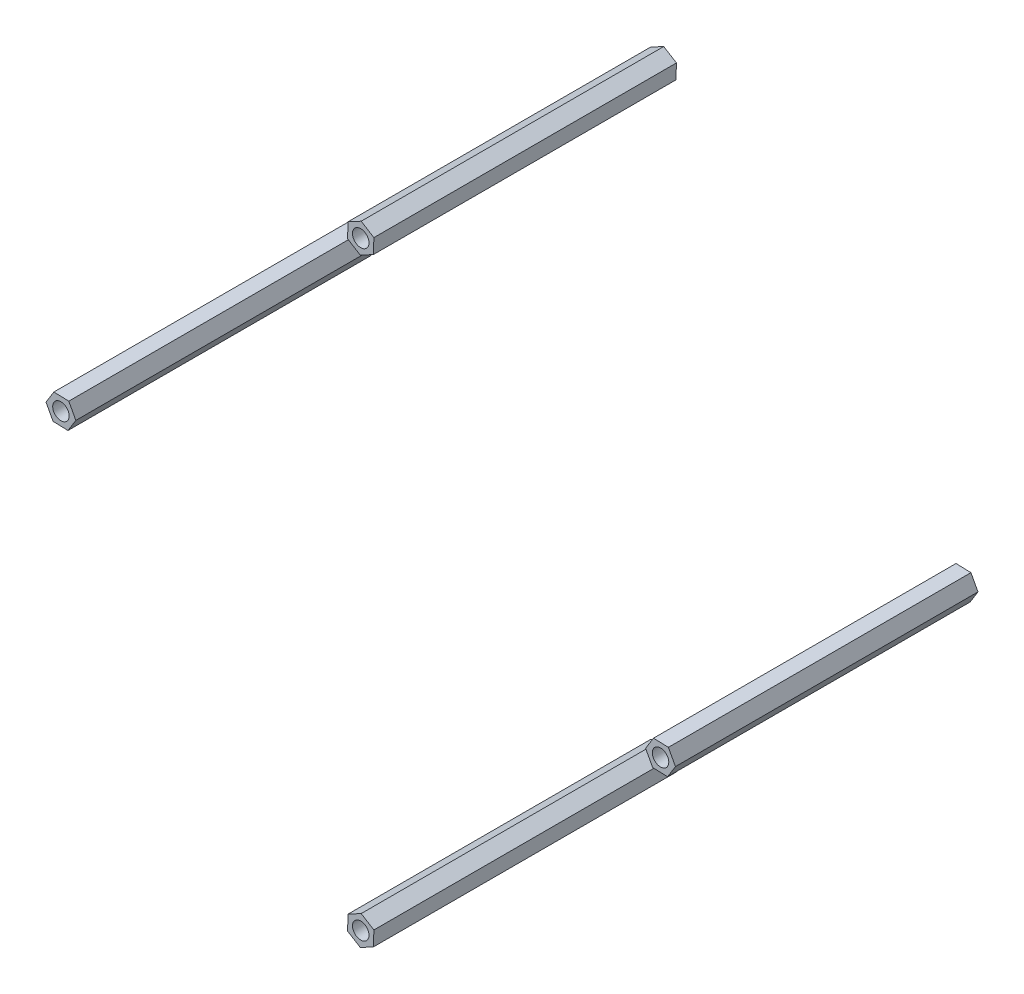
ISO-10303-21;
HEADER;
FILE_DESCRIPTION(('STEP AP214'),'2;1');
FILE_NAME('part.step','',(''),(''),'','','');
FILE_SCHEMA(('AUTOMOTIVE_DESIGN { 1 0 10303 214 1 1 1 1 }'));
ENDSEC;
DATA;
#1=APPLICATION_CONTEXT('core data for automotive mechanical design processes');
#2=APPLICATION_PROTOCOL_DEFINITION('international standard','automotive_design',2000,#1);
#3=PRODUCT_CONTEXT('',#1,'mechanical');
#4=PRODUCT('Part','Part','',(#3));
#5=PRODUCT_RELATED_PRODUCT_CATEGORY('part','',(#4));
#6=PRODUCT_DEFINITION_FORMATION('','',#4);
#7=PRODUCT_DEFINITION_CONTEXT('part definition',#1,'design');
#8=PRODUCT_DEFINITION('design','',#6,#7);
#9=PRODUCT_DEFINITION_SHAPE('','',#8);
#10=(LENGTH_UNIT() NAMED_UNIT(*) SI_UNIT(.MILLI.,.METRE.));
#11=(NAMED_UNIT(*) PLANE_ANGLE_UNIT() SI_UNIT($,.RADIAN.));
#12=(NAMED_UNIT(*) SI_UNIT($,.STERADIAN.) SOLID_ANGLE_UNIT());
#13=UNCERTAINTY_MEASURE_WITH_UNIT(LENGTH_MEASURE(1.E-05),#10,'distance_accuracy_value','');
#14=(GEOMETRIC_REPRESENTATION_CONTEXT(3) GLOBAL_UNCERTAINTY_ASSIGNED_CONTEXT((#13)) GLOBAL_UNIT_ASSIGNED_CONTEXT((#10,
#11,#12)) REPRESENTATION_CONTEXT('',''));
#15=CARTESIAN_POINT('',(0.,0.,0.));
#16=DIRECTION('',(0.,0.,1.));
#17=DIRECTION('',(1.,0.,0.));
#18=AXIS2_PLACEMENT_3D('',#15,#16,#17);
#19=CARTESIAN_POINT('',(0.,0.,55.));
#20=DIRECTION('',(0.,0.,1.));
#21=DIRECTION('',(1.,0.,0.));
#22=AXIS2_PLACEMENT_3D('',#19,#20,#21);
#23=PLANE('',#22);
#24=DIRECTION('',(-0.472942625739873,0.881093225917822,0.));
#25=VECTOR('',#24,1.);
#26=CARTESIAN_POINT('',(-51.7877550712293,-54.5840284457493,55.));
#27=LINE('',#26,#25);
#28=CARTESIAN_POINT('',(-51.7877550712293,-54.5840284457493,55.));
#29=VERTEX_POINT('',#28);
#30=CARTESIAN_POINT('',(-53.0711067669555,-52.1931412132747,55.));
#31=VERTEX_POINT('',#30);
#32=EDGE_CURVE('E140',#29,#31,#27,.T.);
#33=ORIENTED_EDGE('',*,*,#32,.T.);
#34=DIRECTION('',(-0.999520429617152,0.0309662845356627,0.));
#35=VECTOR('',#34,1.);
#36=CARTESIAN_POINT('',(-53.0711067669555,-52.1931412132747,55.));
#37=LINE('',#36,#35);
#38=CARTESIAN_POINT('',(-55.7833516957255,-52.1091127675261,55.));
#39=VERTEX_POINT('',#38);
#40=EDGE_CURVE('E98',#31,#39,#37,.T.);
#41=ORIENTED_EDGE('',*,*,#40,.T.);
#42=DIRECTION('',(-0.526577803877276,-0.850126941382159,0.));
#43=VECTOR('',#42,1.);
#44=CARTESIAN_POINT('',(-55.7833516957255,-52.1091127675261,55.));
#45=LINE('',#44,#43);
#46=CARTESIAN_POINT('',(-57.2122449287692,-54.4159715542521,55.));
#47=VERTEX_POINT('',#46);
#48=EDGE_CURVE('E111',#39,#47,#45,.T.);
#49=ORIENTED_EDGE('',*,*,#48,.T.);
#50=DIRECTION('',(0.472942625739875,-0.881093225917821,0.));
#51=VECTOR('',#50,1.);
#52=CARTESIAN_POINT('',(-57.2122449287692,-54.4159715542521,55.));
#53=LINE('',#52,#51);
#54=CARTESIAN_POINT('',(-55.928893233043,-56.8068587867267,55.));
#55=VERTEX_POINT('',#54);
#56=EDGE_CURVE('E105',#47,#55,#53,.T.);
#57=ORIENTED_EDGE('',*,*,#56,.T.);
#58=DIRECTION('',(0.999520429617152,-0.0309662845356633,0.));
#59=VECTOR('',#58,1.);
#60=CARTESIAN_POINT('',(-55.928893233043,-56.8068587867267,55.));
#61=LINE('',#60,#59);
#62=CARTESIAN_POINT('',(-53.2166483042731,-56.8908872324753,55.));
#63=VERTEX_POINT('',#62);
#64=EDGE_CURVE('E109',#55,#63,#61,.T.);
#65=ORIENTED_EDGE('',*,*,#64,.T.);
#66=DIRECTION('',(0.526577803877275,0.85012694138216,0.));
#67=VECTOR('',#66,1.);
#68=CARTESIAN_POINT('',(-53.2166483042731,-56.8908872324753,55.));
#69=LINE('',#68,#67);
#70=EDGE_CURVE('E61',#63,#29,#69,.T.);
#71=ORIENTED_EDGE('',*,*,#70,.T.);
#72=EDGE_LOOP('',(#33,#41,#49,#57,#65,#71));
#73=FACE_BOUND('',#72,.T.);
#74=CARTESIAN_POINT('',(-54.4999999999993,-54.5000000000002,55.));
#75=DIRECTION('',(0.,0.,1.));
#76=DIRECTION('',(1.,0.,0.));
#77=AXIS2_PLACEMENT_3D('',#74,#75,#76);
#78=CIRCLE('',#77,1.5);
#79=CARTESIAN_POINT('',(-52.9999999999993,-54.5000000000002,55.));
#80=VERTEX_POINT('',#79);
#81=EDGE_CURVE('E133',#80,#80,#78,.T.);
#82=ORIENTED_EDGE('',*,*,#81,.F.);
#83=EDGE_LOOP('',(#82));
#84=FACE_BOUND('',#83,.T.);
#85=ADVANCED_FACE('F44',(#73,#84),#23,.T.);
#86=CARTESIAN_POINT('',(0.,0.,0.));
#87=DIRECTION('',(0.,0.,1.));
#88=DIRECTION('',(1.,0.,0.));
#89=AXIS2_PLACEMENT_3D('',#86,#87,#88);
#90=PLANE('',#89);
#91=DIRECTION('',(-0.472942625739873,0.881093225917822,0.));
#92=VECTOR('',#91,1.);
#93=CARTESIAN_POINT('',(-51.7877550712293,-54.5840284457493,0.));
#94=LINE('',#93,#92);
#95=CARTESIAN_POINT('',(-51.7877550712293,-54.5840284457493,0.));
#96=VERTEX_POINT('',#95);
#97=CARTESIAN_POINT('',(-53.0711067669555,-52.1931412132747,0.));
#98=VERTEX_POINT('',#97);
#99=EDGE_CURVE('E129',#96,#98,#94,.T.);
#100=ORIENTED_EDGE('',*,*,#99,.F.);
#101=DIRECTION('',(0.526577803877275,0.85012694138216,0.));
#102=VECTOR('',#101,1.);
#103=CARTESIAN_POINT('',(-53.2166483042731,-56.8908872324753,0.));
#104=LINE('',#103,#102);
#105=CARTESIAN_POINT('',(-53.2166483042731,-56.8908872324753,0.));
#106=VERTEX_POINT('',#105);
#107=EDGE_CURVE('E90',#106,#96,#104,.T.);
#108=ORIENTED_EDGE('',*,*,#107,.F.);
#109=DIRECTION('',(0.999520429617152,-0.0309662845356633,0.));
#110=VECTOR('',#109,1.);
#111=CARTESIAN_POINT('',(-55.928893233043,-56.8068587867267,0.));
#112=LINE('',#111,#110);
#113=CARTESIAN_POINT('',(-55.928893233043,-56.8068587867267,0.));
#114=VERTEX_POINT('',#113);
#115=EDGE_CURVE('E84',#114,#106,#112,.T.);
#116=ORIENTED_EDGE('',*,*,#115,.F.);
#117=DIRECTION('',(0.472942625739875,-0.881093225917821,0.));
#118=VECTOR('',#117,1.);
#119=CARTESIAN_POINT('',(-57.2122449287692,-54.4159715542521,0.));
#120=LINE('',#119,#118);
#121=CARTESIAN_POINT('',(-57.2122449287692,-54.4159715542521,0.));
#122=VERTEX_POINT('',#121);
#123=EDGE_CURVE('E119',#122,#114,#120,.T.);
#124=ORIENTED_EDGE('',*,*,#123,.F.);
#125=DIRECTION('',(-0.526577803877276,-0.850126941382159,0.));
#126=VECTOR('',#125,1.);
#127=CARTESIAN_POINT('',(-55.7833516957255,-52.1091127675261,0.));
#128=LINE('',#127,#126);
#129=CARTESIAN_POINT('',(-55.7833516957255,-52.1091127675261,0.));
#130=VERTEX_POINT('',#129);
#131=EDGE_CURVE('E135',#130,#122,#128,.T.);
#132=ORIENTED_EDGE('',*,*,#131,.F.);
#133=DIRECTION('',(-0.999520429617152,0.0309662845356627,0.));
#134=VECTOR('',#133,1.);
#135=CARTESIAN_POINT('',(-53.0711067669555,-52.1931412132747,0.));
#136=LINE('',#135,#134);
#137=EDGE_CURVE('E132',#98,#130,#136,.T.);
#138=ORIENTED_EDGE('',*,*,#137,.F.);
#139=EDGE_LOOP('',(#100,#108,#116,#124,#132,#138));
#140=FACE_BOUND('',#139,.T.);
#141=CARTESIAN_POINT('',(-54.4999999999993,-54.5000000000002,0.));
#142=DIRECTION('',(0.,0.,1.));
#143=DIRECTION('',(1.,0.,0.));
#144=AXIS2_PLACEMENT_3D('',#141,#142,#143);
#145=CIRCLE('',#144,1.5);
#146=CARTESIAN_POINT('',(-52.9999999999993,-54.5000000000002,0.));
#147=VERTEX_POINT('',#146);
#148=EDGE_CURVE('E233',#147,#147,#145,.T.);
#149=ORIENTED_EDGE('',*,*,#148,.T.);
#150=EDGE_LOOP('',(#149));
#151=FACE_BOUND('',#150,.T.);
#152=ADVANCED_FACE('F149',(#140,#151),#90,.F.);
#153=CARTESIAN_POINT('',(-51.7877550712293,-54.5840284457493,55.));
#154=DIRECTION('',(-0.881093225917822,-0.472942625739873,0.));
#155=DIRECTION('',(0.472942625739873,-0.881093225917822,0.));
#156=AXIS2_PLACEMENT_3D('',#153,#154,#155);
#157=PLANE('',#156);
#158=ORIENTED_EDGE('',*,*,#99,.T.);
#159=DIRECTION('',(0.,0.,-1.));
#160=VECTOR('',#159,1.);
#161=CARTESIAN_POINT('',(-53.0711067669555,-52.1931412132747,55.));
#162=LINE('',#161,#160);
#163=EDGE_CURVE('E12',#31,#98,#162,.T.);
#164=ORIENTED_EDGE('',*,*,#163,.F.);
#165=ORIENTED_EDGE('',*,*,#32,.F.);
#166=DIRECTION('',(0.,0.,-1.));
#167=VECTOR('',#166,1.);
#168=CARTESIAN_POINT('',(-51.7877550712293,-54.5840284457493,55.));
#169=LINE('',#168,#167);
#170=EDGE_CURVE('E125',#29,#96,#169,.T.);
#171=ORIENTED_EDGE('',*,*,#170,.T.);
#172=EDGE_LOOP('',(#158,#164,#165,#171));
#173=FACE_BOUND('',#172,.T.);
#174=ADVANCED_FACE('F46',(#173),#157,.F.);
#175=CARTESIAN_POINT('',(-53.0711067669555,-52.1931412132747,55.));
#176=DIRECTION('',(-0.0309662845356627,-0.999520429617152,0.));
#177=DIRECTION('',(0.999520429617152,-0.0309662845356627,0.));
#178=AXIS2_PLACEMENT_3D('',#175,#176,#177);
#179=PLANE('',#178);
#180=ORIENTED_EDGE('',*,*,#137,.T.);
#181=DIRECTION('',(0.,0.,-1.));
#182=VECTOR('',#181,1.);
#183=CARTESIAN_POINT('',(-55.7833516957255,-52.1091127675261,55.));
#184=LINE('',#183,#182);
#185=EDGE_CURVE('E53',#39,#130,#184,.T.);
#186=ORIENTED_EDGE('',*,*,#185,.F.);
#187=ORIENTED_EDGE('',*,*,#40,.F.);
#188=ORIENTED_EDGE('',*,*,#163,.T.);
#189=EDGE_LOOP('',(#180,#186,#187,#188));
#190=FACE_BOUND('',#189,.T.);
#191=ADVANCED_FACE('F174',(#190),#179,.F.);
#192=CARTESIAN_POINT('',(-55.7833516957255,-52.1091127675261,55.));
#193=DIRECTION('',(0.850126941382159,-0.526577803877276,0.));
#194=DIRECTION('',(0.526577803877276,0.850126941382159,0.));
#195=AXIS2_PLACEMENT_3D('',#192,#193,#194);
#196=PLANE('',#195);
#197=ORIENTED_EDGE('',*,*,#131,.T.);
#198=DIRECTION('',(0.,0.,-1.));
#199=VECTOR('',#198,1.);
#200=CARTESIAN_POINT('',(-57.2122449287692,-54.4159715542521,55.));
#201=LINE('',#200,#199);
#202=EDGE_CURVE('E120',#47,#122,#201,.T.);
#203=ORIENTED_EDGE('',*,*,#202,.F.);
#204=ORIENTED_EDGE('',*,*,#48,.F.);
#205=ORIENTED_EDGE('',*,*,#185,.T.);
#206=EDGE_LOOP('',(#197,#203,#204,#205));
#207=FACE_BOUND('',#206,.T.);
#208=ADVANCED_FACE('F146',(#207),#196,.F.);
#209=CARTESIAN_POINT('',(-57.2122449287692,-54.4159715542521,55.));
#210=DIRECTION('',(0.881093225917821,0.472942625739875,0.));
#211=DIRECTION('',(-0.472942625739875,0.881093225917821,0.));
#212=AXIS2_PLACEMENT_3D('',#209,#210,#211);
#213=PLANE('',#212);
#214=ORIENTED_EDGE('',*,*,#123,.T.);
#215=DIRECTION('',(0.,0.,-1.));
#216=VECTOR('',#215,1.);
#217=CARTESIAN_POINT('',(-55.928893233043,-56.8068587867267,55.));
#218=LINE('',#217,#216);
#219=EDGE_CURVE('E116',#55,#114,#218,.T.);
#220=ORIENTED_EDGE('',*,*,#219,.F.);
#221=ORIENTED_EDGE('',*,*,#56,.F.);
#222=ORIENTED_EDGE('',*,*,#202,.T.);
#223=EDGE_LOOP('',(#214,#220,#221,#222));
#224=FACE_BOUND('',#223,.T.);
#225=ADVANCED_FACE('F117',(#224),#213,.F.);
#226=CARTESIAN_POINT('',(-55.928893233043,-56.8068587867267,55.));
#227=DIRECTION('',(0.0309662845356633,0.999520429617152,0.));
#228=DIRECTION('',(-0.999520429617152,0.0309662845356633,0.));
#229=AXIS2_PLACEMENT_3D('',#226,#227,#228);
#230=PLANE('',#229);
#231=ORIENTED_EDGE('',*,*,#115,.T.);
#232=DIRECTION('',(0.,0.,-1.));
#233=VECTOR('',#232,1.);
#234=CARTESIAN_POINT('',(-53.2166483042731,-56.8908872324753,55.));
#235=LINE('',#234,#233);
#236=EDGE_CURVE('E121',#63,#106,#235,.T.);
#237=ORIENTED_EDGE('',*,*,#236,.F.);
#238=ORIENTED_EDGE('',*,*,#64,.F.);
#239=ORIENTED_EDGE('',*,*,#219,.T.);
#240=EDGE_LOOP('',(#231,#237,#238,#239));
#241=FACE_BOUND('',#240,.T.);
#242=ADVANCED_FACE('F123',(#241),#230,.F.);
#243=CARTESIAN_POINT('',(-53.2166483042731,-56.8908872324753,55.));
#244=DIRECTION('',(-0.85012694138216,0.526577803877275,0.));
#245=DIRECTION('',(-0.526577803877275,-0.85012694138216,0.));
#246=AXIS2_PLACEMENT_3D('',#243,#244,#245);
#247=PLANE('',#246);
#248=ORIENTED_EDGE('',*,*,#107,.T.);
#249=ORIENTED_EDGE('',*,*,#170,.F.);
#250=ORIENTED_EDGE('',*,*,#70,.F.);
#251=ORIENTED_EDGE('',*,*,#236,.T.);
#252=EDGE_LOOP('',(#248,#249,#250,#251));
#253=FACE_BOUND('',#252,.T.);
#254=ADVANCED_FACE('F154',(#253),#247,.F.);
#255=CARTESIAN_POINT('',(-54.4999999999993,-54.5000000000002,55.));
#256=DIRECTION('',(0.,0.,-1.));
#257=DIRECTION('',(-1.,0.,0.));
#258=AXIS2_PLACEMENT_3D('',#255,#256,#257);
#259=CYLINDRICAL_SURFACE('',#258,1.5);
#260=ORIENTED_EDGE('',*,*,#81,.T.);
#261=EDGE_LOOP('',(#260));
#262=FACE_BOUND('',#261,.T.);
#263=ORIENTED_EDGE('',*,*,#148,.F.);
#264=EDGE_LOOP('',(#263));
#265=FACE_BOUND('',#264,.T.);
#266=ADVANCED_FACE('F156',(#262,#265),#259,.F.);
#267=CLOSED_SHELL('',(#85,#152,#174,#191,#208,#225,#242,#254,#266));
#268=MANIFOLD_SOLID_BREP('B2',#267);
#269=CARTESIAN_POINT('',(0.,0.,55.));
#270=DIRECTION('',(0.,0.,1.));
#271=DIRECTION('',(1.,0.,0.));
#272=AXIS2_PLACEMENT_3D('',#269,#270,#271);
#273=PLANE('',#272);
#274=DIRECTION('',(-0.881093225917821,-0.472942625739875,0.));
#275=VECTOR('',#274,1.);
#276=CARTESIAN_POINT('',(0.0840284457500502,-106.28775507123,55.));
#277=LINE('',#276,#275);
#278=CARTESIAN_POINT('',(0.0840284457500502,-106.28775507123,55.));
#279=VERTEX_POINT('',#278);
#280=CARTESIAN_POINT('',(-2.30685878672455,-107.571106766956,55.));
#281=VERTEX_POINT('',#280);
#282=EDGE_CURVE('E347',#279,#281,#277,.T.);
#283=ORIENTED_EDGE('',*,*,#282,.T.);
#284=DIRECTION('',(-0.0309662845356629,-0.999520429617152,0.));
#285=VECTOR('',#284,1.);
#286=CARTESIAN_POINT('',(-2.30685878672455,-107.571106766956,55.));
#287=LINE('',#286,#285);
#288=CARTESIAN_POINT('',(-2.39088723247314,-110.283351695726,55.));
#289=VERTEX_POINT('',#288);
#290=EDGE_CURVE('E305',#281,#289,#287,.T.);
#291=ORIENTED_EDGE('',*,*,#290,.T.);
#292=DIRECTION('',(0.850126941382158,-0.526577803877277,0.));
#293=VECTOR('',#292,1.);
#294=CARTESIAN_POINT('',(-2.39088723247314,-110.283351695726,55.));
#295=LINE('',#294,#293);
#296=CARTESIAN_POINT('',(-0.0840284457471305,-111.71224492877,55.));
#297=VERTEX_POINT('',#296);
#298=EDGE_CURVE('E318',#289,#297,#295,.T.);
#299=ORIENTED_EDGE('',*,*,#298,.T.);
#300=DIRECTION('',(0.881093225917822,0.472942625739872,0.));
#301=VECTOR('',#300,1.);
#302=CARTESIAN_POINT('',(-0.0840284457471305,-111.71224492877,55.));
#303=LINE('',#302,#301);
#304=CARTESIAN_POINT('',(2.30685878672746,-110.428893233044,55.));
#305=VERTEX_POINT('',#304);
#306=EDGE_CURVE('E312',#297,#305,#303,.T.);
#307=ORIENTED_EDGE('',*,*,#306,.T.);
#308=DIRECTION('',(0.0309662845356653,0.999520429617152,0.));
#309=VECTOR('',#308,1.);
#310=CARTESIAN_POINT('',(2.30685878672746,-110.428893233044,55.));
#311=LINE('',#310,#309);
#312=CARTESIAN_POINT('',(2.39088723247606,-107.716648304274,55.));
#313=VERTEX_POINT('',#312);
#314=EDGE_CURVE('E316',#305,#313,#311,.T.);
#315=ORIENTED_EDGE('',*,*,#314,.T.);
#316=DIRECTION('',(-0.850126941382158,0.526577803877277,0.));
#317=VECTOR('',#316,1.);
#318=CARTESIAN_POINT('',(2.39088723247606,-107.716648304274,55.));
#319=LINE('',#318,#317);
#320=EDGE_CURVE('E268',#313,#279,#319,.T.);
#321=ORIENTED_EDGE('',*,*,#320,.T.);
#322=EDGE_LOOP('',(#283,#291,#299,#307,#315,#321));
#323=FACE_BOUND('',#322,.T.);
#324=CARTESIAN_POINT('',(1.08639768188479E-12,-109.,55.));
#325=DIRECTION('',(0.,0.,1.));
#326=DIRECTION('',(1.,0.,0.));
#327=AXIS2_PLACEMENT_3D('',#324,#325,#326);
#328=CIRCLE('',#327,1.5);
#329=CARTESIAN_POINT('',(1.50000000000109,-109.,55.));
#330=VERTEX_POINT('',#329);
#331=EDGE_CURVE('E340',#330,#330,#328,.T.);
#332=ORIENTED_EDGE('',*,*,#331,.F.);
#333=EDGE_LOOP('',(#332));
#334=FACE_BOUND('',#333,.T.);
#335=ADVANCED_FACE('F251',(#323,#334),#273,.T.);
#336=CARTESIAN_POINT('',(0.,0.,0.));
#337=DIRECTION('',(0.,0.,1.));
#338=DIRECTION('',(1.,0.,0.));
#339=AXIS2_PLACEMENT_3D('',#336,#337,#338);
#340=PLANE('',#339);
#341=DIRECTION('',(-0.881093225917821,-0.472942625739875,0.));
#342=VECTOR('',#341,1.);
#343=CARTESIAN_POINT('',(0.0840284457500502,-106.28775507123,0.));
#344=LINE('',#343,#342);
#345=CARTESIAN_POINT('',(0.0840284457500502,-106.28775507123,0.));
#346=VERTEX_POINT('',#345);
#347=CARTESIAN_POINT('',(-2.30685878672455,-107.571106766956,0.));
#348=VERTEX_POINT('',#347);
#349=EDGE_CURVE('E336',#346,#348,#344,.T.);
#350=ORIENTED_EDGE('',*,*,#349,.F.);
#351=DIRECTION('',(-0.850126941382158,0.526577803877277,0.));
#352=VECTOR('',#351,1.);
#353=CARTESIAN_POINT('',(2.39088723247606,-107.716648304274,0.));
#354=LINE('',#353,#352);
#355=CARTESIAN_POINT('',(2.39088723247606,-107.716648304274,0.));
#356=VERTEX_POINT('',#355);
#357=EDGE_CURVE('E297',#356,#346,#354,.T.);
#358=ORIENTED_EDGE('',*,*,#357,.F.);
#359=DIRECTION('',(0.0309662845356653,0.999520429617152,0.));
#360=VECTOR('',#359,1.);
#361=CARTESIAN_POINT('',(2.30685878672746,-110.428893233044,0.));
#362=LINE('',#361,#360);
#363=CARTESIAN_POINT('',(2.30685878672746,-110.428893233044,0.));
#364=VERTEX_POINT('',#363);
#365=EDGE_CURVE('E291',#364,#356,#362,.T.);
#366=ORIENTED_EDGE('',*,*,#365,.F.);
#367=DIRECTION('',(0.881093225917822,0.472942625739872,0.));
#368=VECTOR('',#367,1.);
#369=CARTESIAN_POINT('',(-0.0840284457471305,-111.71224492877,0.));
#370=LINE('',#369,#368);
#371=CARTESIAN_POINT('',(-0.0840284457471305,-111.71224492877,0.));
#372=VERTEX_POINT('',#371);
#373=EDGE_CURVE('E326',#372,#364,#370,.T.);
#374=ORIENTED_EDGE('',*,*,#373,.F.);
#375=DIRECTION('',(0.850126941382158,-0.526577803877277,0.));
#376=VECTOR('',#375,1.);
#377=CARTESIAN_POINT('',(-2.39088723247314,-110.283351695726,0.));
#378=LINE('',#377,#376);
#379=CARTESIAN_POINT('',(-2.39088723247314,-110.283351695726,0.));
#380=VERTEX_POINT('',#379);
#381=EDGE_CURVE('E342',#380,#372,#378,.T.);
#382=ORIENTED_EDGE('',*,*,#381,.F.);
#383=DIRECTION('',(-0.0309662845356629,-0.999520429617152,0.));
#384=VECTOR('',#383,1.);
#385=CARTESIAN_POINT('',(-2.30685878672455,-107.571106766956,0.));
#386=LINE('',#385,#384);
#387=EDGE_CURVE('E339',#348,#380,#386,.T.);
#388=ORIENTED_EDGE('',*,*,#387,.F.);
#389=EDGE_LOOP('',(#350,#358,#366,#374,#382,#388));
#390=FACE_BOUND('',#389,.T.);
#391=CARTESIAN_POINT('',(1.08639768188479E-12,-109.,0.));
#392=DIRECTION('',(0.,0.,1.));
#393=DIRECTION('',(1.,0.,0.));
#394=AXIS2_PLACEMENT_3D('',#391,#392,#393);
#395=CIRCLE('',#394,1.5);
#396=CARTESIAN_POINT('',(1.50000000000109,-109.,0.));
#397=VERTEX_POINT('',#396);
#398=EDGE_CURVE('E440',#397,#397,#395,.T.);
#399=ORIENTED_EDGE('',*,*,#398,.T.);
#400=EDGE_LOOP('',(#399));
#401=FACE_BOUND('',#400,.T.);
#402=ADVANCED_FACE('F356',(#390,#401),#340,.F.);
#403=CARTESIAN_POINT('',(0.0840284457500502,-106.28775507123,55.));
#404=DIRECTION('',(0.472942625739875,-0.881093225917821,0.));
#405=DIRECTION('',(0.881093225917821,0.472942625739875,0.));
#406=AXIS2_PLACEMENT_3D('',#403,#404,#405);
#407=PLANE('',#406);
#408=ORIENTED_EDGE('',*,*,#349,.T.);
#409=DIRECTION('',(0.,0.,-1.));
#410=VECTOR('',#409,1.);
#411=CARTESIAN_POINT('',(-2.30685878672455,-107.571106766956,55.));
#412=LINE('',#411,#410);
#413=EDGE_CURVE('E42',#281,#348,#412,.T.);
#414=ORIENTED_EDGE('',*,*,#413,.F.);
#415=ORIENTED_EDGE('',*,*,#282,.F.);
#416=DIRECTION('',(0.,0.,-1.));
#417=VECTOR('',#416,1.);
#418=CARTESIAN_POINT('',(0.0840284457500502,-106.28775507123,55.));
#419=LINE('',#418,#417);
#420=EDGE_CURVE('E332',#279,#346,#419,.T.);
#421=ORIENTED_EDGE('',*,*,#420,.T.);
#422=EDGE_LOOP('',(#408,#414,#415,#421));
#423=FACE_BOUND('',#422,.T.);
#424=ADVANCED_FACE('F253',(#423),#407,.F.);
#425=CARTESIAN_POINT('',(-2.30685878672455,-107.571106766956,55.));
#426=DIRECTION('',(0.999520429617152,-0.0309662845356629,0.));
#427=DIRECTION('',(0.0309662845356629,0.999520429617152,0.));
#428=AXIS2_PLACEMENT_3D('',#425,#426,#427);
#429=PLANE('',#428);
#430=ORIENTED_EDGE('',*,*,#387,.T.);
#431=DIRECTION('',(0.,0.,-1.));
#432=VECTOR('',#431,1.);
#433=CARTESIAN_POINT('',(-2.39088723247314,-110.283351695726,55.));
#434=LINE('',#433,#432);
#435=EDGE_CURVE('E260',#289,#380,#434,.T.);
#436=ORIENTED_EDGE('',*,*,#435,.F.);
#437=ORIENTED_EDGE('',*,*,#290,.F.);
#438=ORIENTED_EDGE('',*,*,#413,.T.);
#439=EDGE_LOOP('',(#430,#436,#437,#438));
#440=FACE_BOUND('',#439,.T.);
#441=ADVANCED_FACE('F381',(#440),#429,.F.);
#442=CARTESIAN_POINT('',(-2.39088723247314,-110.283351695726,55.));
#443=DIRECTION('',(0.526577803877277,0.850126941382159,0.));
#444=DIRECTION('',(-0.850126941382159,0.526577803877277,0.));
#445=AXIS2_PLACEMENT_3D('',#442,#443,#444);
#446=PLANE('',#445);
#447=ORIENTED_EDGE('',*,*,#381,.T.);
#448=DIRECTION('',(0.,0.,-1.));
#449=VECTOR('',#448,1.);
#450=CARTESIAN_POINT('',(-0.0840284457471305,-111.71224492877,55.));
#451=LINE('',#450,#449);
#452=EDGE_CURVE('E327',#297,#372,#451,.T.);
#453=ORIENTED_EDGE('',*,*,#452,.F.);
#454=ORIENTED_EDGE('',*,*,#298,.F.);
#455=ORIENTED_EDGE('',*,*,#435,.T.);
#456=EDGE_LOOP('',(#447,#453,#454,#455));
#457=FACE_BOUND('',#456,.T.);
#458=ADVANCED_FACE('F353',(#457),#446,.F.);
#459=CARTESIAN_POINT('',(-0.0840284457471305,-111.71224492877,55.));
#460=DIRECTION('',(-0.472942625739873,0.881093225917822,0.));
#461=DIRECTION('',(-0.881093225917822,-0.472942625739873,0.));
#462=AXIS2_PLACEMENT_3D('',#459,#460,#461);
#463=PLANE('',#462);
#464=ORIENTED_EDGE('',*,*,#373,.T.);
#465=DIRECTION('',(0.,0.,-1.));
#466=VECTOR('',#465,1.);
#467=CARTESIAN_POINT('',(2.30685878672746,-110.428893233044,55.));
#468=LINE('',#467,#466);
#469=EDGE_CURVE('E323',#305,#364,#468,.T.);
#470=ORIENTED_EDGE('',*,*,#469,.F.);
#471=ORIENTED_EDGE('',*,*,#306,.F.);
#472=ORIENTED_EDGE('',*,*,#452,.T.);
#473=EDGE_LOOP('',(#464,#470,#471,#472));
#474=FACE_BOUND('',#473,.T.);
#475=ADVANCED_FACE('F324',(#474),#463,.F.);
#476=CARTESIAN_POINT('',(2.30685878672746,-110.428893233044,55.));
#477=DIRECTION('',(-0.999520429617152,0.0309662845356653,0.));
#478=DIRECTION('',(-0.0309662845356653,-0.999520429617152,0.));
#479=AXIS2_PLACEMENT_3D('',#476,#477,#478);
#480=PLANE('',#479);
#481=ORIENTED_EDGE('',*,*,#365,.T.);
#482=DIRECTION('',(0.,0.,-1.));
#483=VECTOR('',#482,1.);
#484=CARTESIAN_POINT('',(2.39088723247606,-107.716648304274,55.));
#485=LINE('',#484,#483);
#486=EDGE_CURVE('E328',#313,#356,#485,.T.);
#487=ORIENTED_EDGE('',*,*,#486,.F.);
#488=ORIENTED_EDGE('',*,*,#314,.F.);
#489=ORIENTED_EDGE('',*,*,#469,.T.);
#490=EDGE_LOOP('',(#481,#487,#488,#489));
#491=FACE_BOUND('',#490,.T.);
#492=ADVANCED_FACE('F330',(#491),#480,.F.);
#493=CARTESIAN_POINT('',(2.39088723247606,-107.716648304274,55.));
#494=DIRECTION('',(-0.526577803877277,-0.850126941382159,0.));
#495=DIRECTION('',(0.850126941382159,-0.526577803877277,0.));
#496=AXIS2_PLACEMENT_3D('',#493,#494,#495);
#497=PLANE('',#496);
#498=ORIENTED_EDGE('',*,*,#357,.T.);
#499=ORIENTED_EDGE('',*,*,#420,.F.);
#500=ORIENTED_EDGE('',*,*,#320,.F.);
#501=ORIENTED_EDGE('',*,*,#486,.T.);
#502=EDGE_LOOP('',(#498,#499,#500,#501));
#503=FACE_BOUND('',#502,.T.);
#504=ADVANCED_FACE('F361',(#503),#497,.F.);
#505=CARTESIAN_POINT('',(1.08639768188479E-12,-109.,55.));
#506=DIRECTION('',(0.,0.,-1.));
#507=DIRECTION('',(-1.,0.,0.));
#508=AXIS2_PLACEMENT_3D('',#505,#506,#507);
#509=CYLINDRICAL_SURFACE('',#508,1.5);
#510=ORIENTED_EDGE('',*,*,#331,.T.);
#511=EDGE_LOOP('',(#510));
#512=FACE_BOUND('',#511,.T.);
#513=ORIENTED_EDGE('',*,*,#398,.F.);
#514=EDGE_LOOP('',(#513));
#515=FACE_BOUND('',#514,.T.);
#516=ADVANCED_FACE('F363',(#512,#515),#509,.F.);
#517=CLOSED_SHELL('',(#335,#402,#424,#441,#458,#475,#492,#504,#516));
#518=MANIFOLD_SOLID_BREP('B6',#517);
#519=CARTESIAN_POINT('',(0.,0.,55.));
#520=DIRECTION('',(0.,0.,1.));
#521=DIRECTION('',(1.,0.,0.));
#522=AXIS2_PLACEMENT_3D('',#519,#520,#521);
#523=PLANE('',#522);
#524=DIRECTION('',(0.472942625739875,-0.881093225917821,0.));
#525=VECTOR('',#524,1.);
#526=CARTESIAN_POINT('',(51.7877550712308,-54.4159715542507,55.));
#527=LINE('',#526,#525);
#528=CARTESIAN_POINT('',(51.7877550712308,-54.4159715542507,55.));
#529=VERTEX_POINT('',#528);
#530=CARTESIAN_POINT('',(53.0711067669569,-56.8068587867253,55.));
#531=VERTEX_POINT('',#530);
#532=EDGE_CURVE('E553',#529,#531,#527,.T.);
#533=ORIENTED_EDGE('',*,*,#532,.T.);
#534=DIRECTION('',(0.999520429617152,-0.030966284535663,0.));
#535=VECTOR('',#534,1.);
#536=CARTESIAN_POINT('',(53.0711067669569,-56.8068587867253,55.));
#537=LINE('',#536,#535);
#538=CARTESIAN_POINT('',(55.7833516957269,-56.8908872324739,55.));
#539=VERTEX_POINT('',#538);
#540=EDGE_CURVE('E511',#531,#539,#537,.T.);
#541=ORIENTED_EDGE('',*,*,#540,.T.);
#542=DIRECTION('',(0.526577803877277,0.850126941382158,0.));
#543=VECTOR('',#542,1.);
#544=CARTESIAN_POINT('',(55.7833516957269,-56.8908872324739,55.));
#545=LINE('',#544,#543);
#546=CARTESIAN_POINT('',(57.2122449287707,-54.5840284457479,55.));
#547=VERTEX_POINT('',#546);
#548=EDGE_CURVE('E524',#539,#547,#545,.T.);
#549=ORIENTED_EDGE('',*,*,#548,.T.);
#550=DIRECTION('',(-0.472942625739872,0.881093225917822,0.));
#551=VECTOR('',#550,1.);
#552=CARTESIAN_POINT('',(57.2122449287707,-54.5840284457479,55.));
#553=LINE('',#552,#551);
#554=CARTESIAN_POINT('',(55.9288932330445,-52.1931412132733,55.));
#555=VERTEX_POINT('',#554);
#556=EDGE_CURVE('E518',#547,#555,#553,.T.);
#557=ORIENTED_EDGE('',*,*,#556,.T.);
#558=DIRECTION('',(-0.999520429617152,0.0309662845356654,0.));
#559=VECTOR('',#558,1.);
#560=CARTESIAN_POINT('',(55.9288932330445,-52.1931412132733,55.));
#561=LINE('',#560,#559);
#562=CARTESIAN_POINT('',(53.2166483042746,-52.1091127675247,55.));
#563=VERTEX_POINT('',#562);
#564=EDGE_CURVE('E522',#555,#563,#561,.T.);
#565=ORIENTED_EDGE('',*,*,#564,.T.);
#566=DIRECTION('',(-0.526577803877277,-0.850126941382158,0.));
#567=VECTOR('',#566,1.);
#568=CARTESIAN_POINT('',(53.2166483042746,-52.1091127675247,55.));
#569=LINE('',#568,#567);
#570=EDGE_CURVE('E474',#563,#529,#569,.T.);
#571=ORIENTED_EDGE('',*,*,#570,.T.);
#572=EDGE_LOOP('',(#533,#541,#549,#557,#565,#571));
#573=FACE_BOUND('',#572,.T.);
#574=CARTESIAN_POINT('',(54.5000000000007,-54.4999999999994,55.));
#575=DIRECTION('',(0.,0.,1.));
#576=DIRECTION('',(1.,0.,0.));
#577=AXIS2_PLACEMENT_3D('',#574,#575,#576);
#578=CIRCLE('',#577,1.5);
#579=CARTESIAN_POINT('',(56.0000000000007,-54.4999999999994,55.));
#580=VERTEX_POINT('',#579);
#581=EDGE_CURVE('E546',#580,#580,#578,.T.);
#582=ORIENTED_EDGE('',*,*,#581,.F.);
#583=EDGE_LOOP('',(#582));
#584=FACE_BOUND('',#583,.T.);
#585=ADVANCED_FACE('F457',(#573,#584),#523,.T.);
#586=CARTESIAN_POINT('',(0.,0.,0.));
#587=DIRECTION('',(0.,0.,1.));
#588=DIRECTION('',(1.,0.,0.));
#589=AXIS2_PLACEMENT_3D('',#586,#587,#588);
#590=PLANE('',#589);
#591=DIRECTION('',(0.472942625739875,-0.881093225917821,0.));
#592=VECTOR('',#591,1.);
#593=CARTESIAN_POINT('',(51.7877550712308,-54.4159715542507,0.));
#594=LINE('',#593,#592);
#595=CARTESIAN_POINT('',(51.7877550712308,-54.4159715542507,0.));
#596=VERTEX_POINT('',#595);
#597=CARTESIAN_POINT('',(53.0711067669569,-56.8068587867253,0.));
#598=VERTEX_POINT('',#597);
#599=EDGE_CURVE('E542',#596,#598,#594,.T.);
#600=ORIENTED_EDGE('',*,*,#599,.F.);
#601=DIRECTION('',(-0.526577803877277,-0.850126941382158,0.));
#602=VECTOR('',#601,1.);
#603=CARTESIAN_POINT('',(53.2166483042746,-52.1091127675247,0.));
#604=LINE('',#603,#602);
#605=CARTESIAN_POINT('',(53.2166483042746,-52.1091127675247,0.));
#606=VERTEX_POINT('',#605);
#607=EDGE_CURVE('E503',#606,#596,#604,.T.);
#608=ORIENTED_EDGE('',*,*,#607,.F.);
#609=DIRECTION('',(-0.999520429617152,0.0309662845356654,0.));
#610=VECTOR('',#609,1.);
#611=CARTESIAN_POINT('',(55.9288932330445,-52.1931412132733,0.));
#612=LINE('',#611,#610);
#613=CARTESIAN_POINT('',(55.9288932330445,-52.1931412132733,0.));
#614=VERTEX_POINT('',#613);
#615=EDGE_CURVE('E497',#614,#606,#612,.T.);
#616=ORIENTED_EDGE('',*,*,#615,.F.);
#617=DIRECTION('',(-0.472942625739872,0.881093225917822,0.));
#618=VECTOR('',#617,1.);
#619=CARTESIAN_POINT('',(57.2122449287707,-54.5840284457479,0.));
#620=LINE('',#619,#618);
#621=CARTESIAN_POINT('',(57.2122449287707,-54.5840284457479,0.));
#622=VERTEX_POINT('',#621);
#623=EDGE_CURVE('E532',#622,#614,#620,.T.);
#624=ORIENTED_EDGE('',*,*,#623,.F.);
#625=DIRECTION('',(0.526577803877277,0.850126941382158,0.));
#626=VECTOR('',#625,1.);
#627=CARTESIAN_POINT('',(55.7833516957269,-56.8908872324739,0.));
#628=LINE('',#627,#626);
#629=CARTESIAN_POINT('',(55.7833516957269,-56.8908872324739,0.));
#630=VERTEX_POINT('',#629);
#631=EDGE_CURVE('E548',#630,#622,#628,.T.);
#632=ORIENTED_EDGE('',*,*,#631,.F.);
#633=DIRECTION('',(0.999520429617152,-0.030966284535663,0.));
#634=VECTOR('',#633,1.);
#635=CARTESIAN_POINT('',(53.0711067669569,-56.8068587867253,0.));
#636=LINE('',#635,#634);
#637=EDGE_CURVE('E545',#598,#630,#636,.T.);
#638=ORIENTED_EDGE('',*,*,#637,.F.);
#639=EDGE_LOOP('',(#600,#608,#616,#624,#632,#638));
#640=FACE_BOUND('',#639,.T.);
#641=CARTESIAN_POINT('',(54.5000000000007,-54.4999999999994,0.));
#642=DIRECTION('',(0.,0.,1.));
#643=DIRECTION('',(1.,0.,0.));
#644=AXIS2_PLACEMENT_3D('',#641,#642,#643);
#645=CIRCLE('',#644,1.5);
#646=CARTESIAN_POINT('',(56.0000000000007,-54.4999999999994,0.));
#647=VERTEX_POINT('',#646);
#648=EDGE_CURVE('E646',#647,#647,#645,.T.);
#649=ORIENTED_EDGE('',*,*,#648,.T.);
#650=EDGE_LOOP('',(#649));
#651=FACE_BOUND('',#650,.T.);
#652=ADVANCED_FACE('F562',(#640,#651),#590,.F.);
#653=CARTESIAN_POINT('',(51.7877550712308,-54.4159715542507,55.));
#654=DIRECTION('',(0.881093225917821,0.472942625739875,0.));
#655=DIRECTION('',(-0.472942625739875,0.881093225917821,0.));
#656=AXIS2_PLACEMENT_3D('',#653,#654,#655);
#657=PLANE('',#656);
#658=ORIENTED_EDGE('',*,*,#599,.T.);
#659=DIRECTION('',(0.,0.,-1.));
#660=VECTOR('',#659,1.);
#661=CARTESIAN_POINT('',(53.0711067669569,-56.8068587867253,55.));
#662=LINE('',#661,#660);
#663=EDGE_CURVE('E249',#531,#598,#662,.T.);
#664=ORIENTED_EDGE('',*,*,#663,.F.);
#665=ORIENTED_EDGE('',*,*,#532,.F.);
#666=DIRECTION('',(0.,0.,-1.));
#667=VECTOR('',#666,1.);
#668=CARTESIAN_POINT('',(51.7877550712308,-54.4159715542507,55.));
#669=LINE('',#668,#667);
#670=EDGE_CURVE('E538',#529,#596,#669,.T.);
#671=ORIENTED_EDGE('',*,*,#670,.T.);
#672=EDGE_LOOP('',(#658,#664,#665,#671));
#673=FACE_BOUND('',#672,.T.);
#674=ADVANCED_FACE('F459',(#673),#657,.F.);
#675=CARTESIAN_POINT('',(53.0711067669569,-56.8068587867253,55.));
#676=DIRECTION('',(0.030966284535663,0.999520429617152,0.));
#677=DIRECTION('',(-0.999520429617152,0.030966284535663,0.));
#678=AXIS2_PLACEMENT_3D('',#675,#676,#677);
#679=PLANE('',#678);
#680=ORIENTED_EDGE('',*,*,#637,.T.);
#681=DIRECTION('',(0.,0.,-1.));
#682=VECTOR('',#681,1.);
#683=CARTESIAN_POINT('',(55.7833516957269,-56.8908872324739,55.));
#684=LINE('',#683,#682);
#685=EDGE_CURVE('E466',#539,#630,#684,.T.);
#686=ORIENTED_EDGE('',*,*,#685,.F.);
#687=ORIENTED_EDGE('',*,*,#540,.F.);
#688=ORIENTED_EDGE('',*,*,#663,.T.);
#689=EDGE_LOOP('',(#680,#686,#687,#688));
#690=FACE_BOUND('',#689,.T.);
#691=ADVANCED_FACE('F587',(#690),#679,.F.);
#692=CARTESIAN_POINT('',(55.7833516957269,-56.8908872324739,55.));
#693=DIRECTION('',(-0.850126941382159,0.526577803877277,0.));
#694=DIRECTION('',(-0.526577803877277,-0.850126941382159,0.));
#695=AXIS2_PLACEMENT_3D('',#692,#693,#694);
#696=PLANE('',#695);
#697=ORIENTED_EDGE('',*,*,#631,.T.);
#698=DIRECTION('',(0.,0.,-1.));
#699=VECTOR('',#698,1.);
#700=CARTESIAN_POINT('',(57.2122449287707,-54.5840284457479,55.));
#701=LINE('',#700,#699);
#702=EDGE_CURVE('E533',#547,#622,#701,.T.);
#703=ORIENTED_EDGE('',*,*,#702,.F.);
#704=ORIENTED_EDGE('',*,*,#548,.F.);
#705=ORIENTED_EDGE('',*,*,#685,.T.);
#706=EDGE_LOOP('',(#697,#703,#704,#705));
#707=FACE_BOUND('',#706,.T.);
#708=ADVANCED_FACE('F559',(#707),#696,.F.);
#709=CARTESIAN_POINT('',(57.2122449287707,-54.5840284457479,55.));
#710=DIRECTION('',(-0.881093225917822,-0.472942625739873,0.));
#711=DIRECTION('',(0.472942625739873,-0.881093225917822,0.));
#712=AXIS2_PLACEMENT_3D('',#709,#710,#711);
#713=PLANE('',#712);
#714=ORIENTED_EDGE('',*,*,#623,.T.);
#715=DIRECTION('',(0.,0.,-1.));
#716=VECTOR('',#715,1.);
#717=CARTESIAN_POINT('',(55.9288932330445,-52.1931412132733,55.));
#718=LINE('',#717,#716);
#719=EDGE_CURVE('E529',#555,#614,#718,.T.);
#720=ORIENTED_EDGE('',*,*,#719,.F.);
#721=ORIENTED_EDGE('',*,*,#556,.F.);
#722=ORIENTED_EDGE('',*,*,#702,.T.);
#723=EDGE_LOOP('',(#714,#720,#721,#722));
#724=FACE_BOUND('',#723,.T.);
#725=ADVANCED_FACE('F530',(#724),#713,.F.);
#726=CARTESIAN_POINT('',(55.9288932330445,-52.1931412132733,55.));
#727=DIRECTION('',(-0.0309662845356654,-0.999520429617152,0.));
#728=DIRECTION('',(0.999520429617152,-0.0309662845356654,0.));
#729=AXIS2_PLACEMENT_3D('',#726,#727,#728);
#730=PLANE('',#729);
#731=ORIENTED_EDGE('',*,*,#615,.T.);
#732=DIRECTION('',(0.,0.,-1.));
#733=VECTOR('',#732,1.);
#734=CARTESIAN_POINT('',(53.2166483042746,-52.1091127675247,55.));
#735=LINE('',#734,#733);
#736=EDGE_CURVE('E534',#563,#606,#735,.T.);
#737=ORIENTED_EDGE('',*,*,#736,.F.);
#738=ORIENTED_EDGE('',*,*,#564,.F.);
#739=ORIENTED_EDGE('',*,*,#719,.T.);
#740=EDGE_LOOP('',(#731,#737,#738,#739));
#741=FACE_BOUND('',#740,.T.);
#742=ADVANCED_FACE('F536',(#741),#730,.F.);
#743=CARTESIAN_POINT('',(53.2166483042746,-52.1091127675247,55.));
#744=DIRECTION('',(0.850126941382159,-0.526577803877277,0.));
#745=DIRECTION('',(0.526577803877277,0.850126941382159,0.));
#746=AXIS2_PLACEMENT_3D('',#743,#744,#745);
#747=PLANE('',#746);
#748=ORIENTED_EDGE('',*,*,#607,.T.);
#749=ORIENTED_EDGE('',*,*,#670,.F.);
#750=ORIENTED_EDGE('',*,*,#570,.F.);
#751=ORIENTED_EDGE('',*,*,#736,.T.);
#752=EDGE_LOOP('',(#748,#749,#750,#751));
#753=FACE_BOUND('',#752,.T.);
#754=ADVANCED_FACE('F567',(#753),#747,.F.);
#755=CARTESIAN_POINT('',(54.5000000000007,-54.4999999999994,55.));
#756=DIRECTION('',(0.,0.,-1.));
#757=DIRECTION('',(-1.,0.,0.));
#758=AXIS2_PLACEMENT_3D('',#755,#756,#757);
#759=CYLINDRICAL_SURFACE('',#758,1.5);
#760=ORIENTED_EDGE('',*,*,#581,.T.);
#761=EDGE_LOOP('',(#760));
#762=FACE_BOUND('',#761,.T.);
#763=ORIENTED_EDGE('',*,*,#648,.F.);
#764=EDGE_LOOP('',(#763));
#765=FACE_BOUND('',#764,.T.);
#766=ADVANCED_FACE('F569',(#762,#765),#759,.F.);
#767=CLOSED_SHELL('',(#585,#652,#674,#691,#708,#725,#742,#754,#766));
#768=MANIFOLD_SOLID_BREP('B36',#767);
#769=CARTESIAN_POINT('',(0.,0.,55.));
#770=DIRECTION('',(0.,0.,1.));
#771=DIRECTION('',(1.,0.,0.));
#772=AXIS2_PLACEMENT_3D('',#769,#770,#771);
#773=PLANE('',#772);
#774=DIRECTION('',(0.881093225917821,0.472942625739875,0.));
#775=VECTOR('',#774,1.);
#776=CARTESIAN_POINT('',(-0.0840284457485768,-2.71224492876997,55.));
#777=LINE('',#776,#775);
#778=CARTESIAN_POINT('',(-0.0840284457485768,-2.71224492876997,55.));
#779=VERTEX_POINT('',#778);
#780=CARTESIAN_POINT('',(2.30685878672602,-1.42889323304379,55.));
#781=VERTEX_POINT('',#780);
#782=EDGE_CURVE('E750',#779,#781,#777,.T.);
#783=ORIENTED_EDGE('',*,*,#782,.T.);
#784=DIRECTION('',(0.030966284535663,0.999520429617152,0.));
#785=VECTOR('',#784,1.);
#786=CARTESIAN_POINT('',(2.30685878672602,-1.42889323304379,55.));
#787=LINE('',#786,#785);
#788=CARTESIAN_POINT('',(2.39088723247462,1.28335169572617,55.));
#789=VERTEX_POINT('',#788);
#790=EDGE_CURVE('E708',#781,#789,#787,.T.);
#791=ORIENTED_EDGE('',*,*,#790,.T.);
#792=DIRECTION('',(-0.850126941382158,0.526577803877277,0.));
#793=VECTOR('',#792,1.);
#794=CARTESIAN_POINT('',(2.39088723247462,1.28335169572617,55.));
#795=LINE('',#794,#793);
#796=CARTESIAN_POINT('',(0.0840284457486046,2.71224492876997,55.));
#797=VERTEX_POINT('',#796);
#798=EDGE_CURVE('E721',#789,#797,#795,.T.);
#799=ORIENTED_EDGE('',*,*,#798,.T.);
#800=DIRECTION('',(-0.881093225917822,-0.472942625739872,0.));
#801=VECTOR('',#800,1.);
#802=CARTESIAN_POINT('',(0.0840284457486046,2.71224492876997,55.));
#803=LINE('',#802,#801);
#804=CARTESIAN_POINT('',(-2.30685878672598,1.42889323304381,55.));
#805=VERTEX_POINT('',#804);
#806=EDGE_CURVE('E715',#797,#805,#803,.T.);
#807=ORIENTED_EDGE('',*,*,#806,.T.);
#808=DIRECTION('',(-0.0309662845356654,-0.999520429617152,0.));
#809=VECTOR('',#808,1.);
#810=CARTESIAN_POINT('',(-2.30685878672598,1.42889323304381,55.));
#811=LINE('',#810,#809);
#812=CARTESIAN_POINT('',(-2.39088723247459,-1.28335169572617,55.));
#813=VERTEX_POINT('',#812);
#814=EDGE_CURVE('E719',#805,#813,#811,.T.);
#815=ORIENTED_EDGE('',*,*,#814,.T.);
#816=DIRECTION('',(0.850126941382158,-0.526577803877277,0.));
#817=VECTOR('',#816,1.);
#818=CARTESIAN_POINT('',(-2.39088723247459,-1.28335169572617,55.));
#819=LINE('',#818,#817);
#820=EDGE_CURVE('E671',#813,#779,#819,.T.);
#821=ORIENTED_EDGE('',*,*,#820,.T.);
#822=EDGE_LOOP('',(#783,#791,#799,#807,#815,#821));
#823=FACE_BOUND('',#822,.T.);
#824=CARTESIAN_POINT('',(0.,0.,55.));
#825=DIRECTION('',(0.,0.,1.));
#826=DIRECTION('',(1.,0.,0.));
#827=AXIS2_PLACEMENT_3D('',#824,#825,#826);
#828=CIRCLE('',#827,1.5);
#829=CARTESIAN_POINT('',(1.5,0.,55.));
#830=VERTEX_POINT('',#829);
#831=EDGE_CURVE('E743',#830,#830,#828,.T.);
#832=ORIENTED_EDGE('',*,*,#831,.F.);
#833=EDGE_LOOP('',(#832));
#834=FACE_BOUND('',#833,.T.);
#835=ADVANCED_FACE('F654',(#823,#834),#773,.T.);
#836=CARTESIAN_POINT('',(0.,0.,0.));
#837=DIRECTION('',(0.,0.,1.));
#838=DIRECTION('',(1.,0.,0.));
#839=AXIS2_PLACEMENT_3D('',#836,#837,#838);
#840=PLANE('',#839);
#841=DIRECTION('',(0.881093225917821,0.472942625739875,0.));
#842=VECTOR('',#841,1.);
#843=CARTESIAN_POINT('',(-0.0840284457485768,-2.71224492876997,0.));
#844=LINE('',#843,#842);
#845=CARTESIAN_POINT('',(-0.0840284457485768,-2.71224492876997,0.));
#846=VERTEX_POINT('',#845);
#847=CARTESIAN_POINT('',(2.30685878672602,-1.42889323304379,0.));
#848=VERTEX_POINT('',#847);
#849=EDGE_CURVE('E739',#846,#848,#844,.T.);
#850=ORIENTED_EDGE('',*,*,#849,.F.);
#851=DIRECTION('',(0.850126941382158,-0.526577803877277,0.));
#852=VECTOR('',#851,1.);
#853=CARTESIAN_POINT('',(-2.39088723247459,-1.28335169572617,0.));
#854=LINE('',#853,#852);
#855=CARTESIAN_POINT('',(-2.39088723247459,-1.28335169572617,0.));
#856=VERTEX_POINT('',#855);
#857=EDGE_CURVE('E700',#856,#846,#854,.T.);
#858=ORIENTED_EDGE('',*,*,#857,.F.);
#859=DIRECTION('',(-0.0309662845356654,-0.999520429617152,0.));
#860=VECTOR('',#859,1.);
#861=CARTESIAN_POINT('',(-2.30685878672598,1.42889323304381,0.));
#862=LINE('',#861,#860);
#863=CARTESIAN_POINT('',(-2.30685878672598,1.42889323304381,0.));
#864=VERTEX_POINT('',#863);
#865=EDGE_CURVE('E694',#864,#856,#862,.T.);
#866=ORIENTED_EDGE('',*,*,#865,.F.);
#867=DIRECTION('',(-0.881093225917822,-0.472942625739872,0.));
#868=VECTOR('',#867,1.);
#869=CARTESIAN_POINT('',(0.0840284457486046,2.71224492876997,0.));
#870=LINE('',#869,#868);
#871=CARTESIAN_POINT('',(0.0840284457486046,2.71224492876997,0.));
#872=VERTEX_POINT('',#871);
#873=EDGE_CURVE('E729',#872,#864,#870,.T.);
#874=ORIENTED_EDGE('',*,*,#873,.F.);
#875=DIRECTION('',(-0.850126941382158,0.526577803877277,0.));
#876=VECTOR('',#875,1.);
#877=CARTESIAN_POINT('',(2.39088723247462,1.28335169572617,0.));
#878=LINE('',#877,#876);
#879=CARTESIAN_POINT('',(2.39088723247462,1.28335169572617,0.));
#880=VERTEX_POINT('',#879);
#881=EDGE_CURVE('E745',#880,#872,#878,.T.);
#882=ORIENTED_EDGE('',*,*,#881,.F.);
#883=DIRECTION('',(0.030966284535663,0.999520429617152,0.));
#884=VECTOR('',#883,1.);
#885=CARTESIAN_POINT('',(2.30685878672602,-1.42889323304379,0.));
#886=LINE('',#885,#884);
#887=EDGE_CURVE('E742',#848,#880,#886,.T.);
#888=ORIENTED_EDGE('',*,*,#887,.F.);
#889=EDGE_LOOP('',(#850,#858,#866,#874,#882,#888));
#890=FACE_BOUND('',#889,.T.);
#891=CARTESIAN_POINT('',(0.,0.,0.));
#892=DIRECTION('',(0.,0.,1.));
#893=DIRECTION('',(1.,0.,0.));
#894=AXIS2_PLACEMENT_3D('',#891,#892,#893);
#895=CIRCLE('',#894,1.5);
#896=CARTESIAN_POINT('',(1.5,0.,0.));
#897=VERTEX_POINT('',#896);
#898=EDGE_CURVE('E843',#897,#897,#895,.T.);
#899=ORIENTED_EDGE('',*,*,#898,.T.);
#900=EDGE_LOOP('',(#899));
#901=FACE_BOUND('',#900,.T.);
#902=ADVANCED_FACE('F759',(#890,#901),#840,.F.);
#903=CARTESIAN_POINT('',(-0.0840284457485768,-2.71224492876997,55.));
#904=DIRECTION('',(-0.472942625739875,0.881093225917821,0.));
#905=DIRECTION('',(-0.881093225917821,-0.472942625739875,0.));
#906=AXIS2_PLACEMENT_3D('',#903,#904,#905);
#907=PLANE('',#906);
#908=ORIENTED_EDGE('',*,*,#849,.T.);
#909=DIRECTION('',(0.,0.,-1.));
#910=VECTOR('',#909,1.);
#911=CARTESIAN_POINT('',(2.30685878672602,-1.42889323304379,55.));
#912=LINE('',#911,#910);
#913=EDGE_CURVE('E455',#781,#848,#912,.T.);
#914=ORIENTED_EDGE('',*,*,#913,.F.);
#915=ORIENTED_EDGE('',*,*,#782,.F.);
#916=DIRECTION('',(0.,0.,-1.));
#917=VECTOR('',#916,1.);
#918=CARTESIAN_POINT('',(-0.0840284457485768,-2.71224492876997,55.));
#919=LINE('',#918,#917);
#920=EDGE_CURVE('E735',#779,#846,#919,.T.);
#921=ORIENTED_EDGE('',*,*,#920,.T.);
#922=EDGE_LOOP('',(#908,#914,#915,#921));
#923=FACE_BOUND('',#922,.T.);
#924=ADVANCED_FACE('F656',(#923),#907,.F.);
#925=CARTESIAN_POINT('',(2.30685878672602,-1.42889323304379,55.));
#926=DIRECTION('',(-0.999520429617152,0.030966284535663,0.));
#927=DIRECTION('',(-0.030966284535663,-0.999520429617152,0.));
#928=AXIS2_PLACEMENT_3D('',#925,#926,#927);
#929=PLANE('',#928);
#930=ORIENTED_EDGE('',*,*,#887,.T.);
#931=DIRECTION('',(0.,0.,-1.));
#932=VECTOR('',#931,1.);
#933=CARTESIAN_POINT('',(2.39088723247462,1.28335169572617,55.));
#934=LINE('',#933,#932);
#935=EDGE_CURVE('E663',#789,#880,#934,.T.);
#936=ORIENTED_EDGE('',*,*,#935,.F.);
#937=ORIENTED_EDGE('',*,*,#790,.F.);
#938=ORIENTED_EDGE('',*,*,#913,.T.);
#939=EDGE_LOOP('',(#930,#936,#937,#938));
#940=FACE_BOUND('',#939,.T.);
#941=ADVANCED_FACE('F784',(#940),#929,.F.);
#942=CARTESIAN_POINT('',(2.39088723247462,1.28335169572617,55.));
#943=DIRECTION('',(-0.526577803877277,-0.850126941382159,0.));
#944=DIRECTION('',(0.850126941382159,-0.526577803877277,0.));
#945=AXIS2_PLACEMENT_3D('',#942,#943,#944);
#946=PLANE('',#945);
#947=ORIENTED_EDGE('',*,*,#881,.T.);
#948=DIRECTION('',(0.,0.,-1.));
#949=VECTOR('',#948,1.);
#950=CARTESIAN_POINT('',(0.0840284457486046,2.71224492876997,55.));
#951=LINE('',#950,#949);
#952=EDGE_CURVE('E730',#797,#872,#951,.T.);
#953=ORIENTED_EDGE('',*,*,#952,.F.);
#954=ORIENTED_EDGE('',*,*,#798,.F.);
#955=ORIENTED_EDGE('',*,*,#935,.T.);
#956=EDGE_LOOP('',(#947,#953,#954,#955));
#957=FACE_BOUND('',#956,.T.);
#958=ADVANCED_FACE('F756',(#957),#946,.F.);
#959=CARTESIAN_POINT('',(0.0840284457486046,2.71224492876997,55.));
#960=DIRECTION('',(0.472942625739873,-0.881093225917822,0.));
#961=DIRECTION('',(0.881093225917822,0.472942625739873,0.));
#962=AXIS2_PLACEMENT_3D('',#959,#960,#961);
#963=PLANE('',#962);
#964=ORIENTED_EDGE('',*,*,#873,.T.);
#965=DIRECTION('',(0.,0.,-1.));
#966=VECTOR('',#965,1.);
#967=CARTESIAN_POINT('',(-2.30685878672598,1.42889323304381,55.));
#968=LINE('',#967,#966);
#969=EDGE_CURVE('E726',#805,#864,#968,.T.);
#970=ORIENTED_EDGE('',*,*,#969,.F.);
#971=ORIENTED_EDGE('',*,*,#806,.F.);
#972=ORIENTED_EDGE('',*,*,#952,.T.);
#973=EDGE_LOOP('',(#964,#970,#971,#972));
#974=FACE_BOUND('',#973,.T.);
#975=ADVANCED_FACE('F727',(#974),#963,.F.);
#976=CARTESIAN_POINT('',(-2.30685878672598,1.42889323304381,55.));
#977=DIRECTION('',(0.999520429617152,-0.0309662845356654,0.));
#978=DIRECTION('',(0.0309662845356654,0.999520429617152,0.));
#979=AXIS2_PLACEMENT_3D('',#976,#977,#978);
#980=PLANE('',#979);
#981=ORIENTED_EDGE('',*,*,#865,.T.);
#982=DIRECTION('',(0.,0.,-1.));
#983=VECTOR('',#982,1.);
#984=CARTESIAN_POINT('',(-2.39088723247459,-1.28335169572617,55.));
#985=LINE('',#984,#983);
#986=EDGE_CURVE('E731',#813,#856,#985,.T.);
#987=ORIENTED_EDGE('',*,*,#986,.F.);
#988=ORIENTED_EDGE('',*,*,#814,.F.);
#989=ORIENTED_EDGE('',*,*,#969,.T.);
#990=EDGE_LOOP('',(#981,#987,#988,#989));
#991=FACE_BOUND('',#990,.T.);
#992=ADVANCED_FACE('F733',(#991),#980,.F.);
#993=CARTESIAN_POINT('',(-2.39088723247459,-1.28335169572617,55.));
#994=DIRECTION('',(0.526577803877277,0.850126941382159,0.));
#995=DIRECTION('',(-0.850126941382159,0.526577803877277,0.));
#996=AXIS2_PLACEMENT_3D('',#993,#994,#995);
#997=PLANE('',#996);
#998=ORIENTED_EDGE('',*,*,#857,.T.);
#999=ORIENTED_EDGE('',*,*,#920,.F.);
#1000=ORIENTED_EDGE('',*,*,#820,.F.);
#1001=ORIENTED_EDGE('',*,*,#986,.T.);
#1002=EDGE_LOOP('',(#998,#999,#1000,#1001));
#1003=FACE_BOUND('',#1002,.T.);
#1004=ADVANCED_FACE('F764',(#1003),#997,.F.);
#1005=CARTESIAN_POINT('',(0.,0.,55.));
#1006=DIRECTION('',(0.,0.,-1.));
#1007=DIRECTION('',(-1.,0.,0.));
#1008=AXIS2_PLACEMENT_3D('',#1005,#1006,#1007);
#1009=CYLINDRICAL_SURFACE('',#1008,1.5);
#1010=ORIENTED_EDGE('',*,*,#831,.T.);
#1011=EDGE_LOOP('',(#1010));
#1012=FACE_BOUND('',#1011,.T.);
#1013=ORIENTED_EDGE('',*,*,#898,.F.);
#1014=EDGE_LOOP('',(#1013));
#1015=FACE_BOUND('',#1014,.T.);
#1016=ADVANCED_FACE('F766',(#1012,#1015),#1009,.F.);
#1017=CLOSED_SHELL('',(#835,#902,#924,#941,#958,#975,#992,#1004,#1016));
#1018=MANIFOLD_SOLID_BREP('B243',#1017);
#1019=ADVANCED_BREP_SHAPE_REPRESENTATION('',(#18,#268,#518,#768,#1018),#14);
#1020=SHAPE_DEFINITION_REPRESENTATION(#9,#1019);
ENDSEC;
END-ISO-10303-21;
